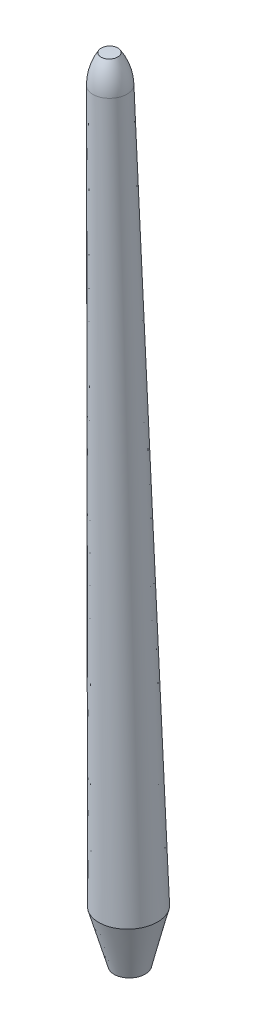
ISO-10303-21;
HEADER;
FILE_DESCRIPTION(('STEP AP214'),'2;1');
FILE_NAME('part.step','',(''),(''),'','','');
FILE_SCHEMA(('AUTOMOTIVE_DESIGN { 1 0 10303 214 1 1 1 1 }'));
ENDSEC;
DATA;
#1=APPLICATION_CONTEXT('core data for automotive mechanical design processes');
#2=APPLICATION_PROTOCOL_DEFINITION('international standard','automotive_design',2000,#1);
#3=PRODUCT_CONTEXT('',#1,'mechanical');
#4=PRODUCT('Part','Part','',(#3));
#5=PRODUCT_RELATED_PRODUCT_CATEGORY('part','',(#4));
#6=PRODUCT_DEFINITION_FORMATION('','',#4);
#7=PRODUCT_DEFINITION_CONTEXT('part definition',#1,'design');
#8=PRODUCT_DEFINITION('design','',#6,#7);
#9=PRODUCT_DEFINITION_SHAPE('','',#8);
#10=(LENGTH_UNIT() NAMED_UNIT(*) SI_UNIT(.MILLI.,.METRE.));
#11=(NAMED_UNIT(*) PLANE_ANGLE_UNIT() SI_UNIT($,.RADIAN.));
#12=(NAMED_UNIT(*) SI_UNIT($,.STERADIAN.) SOLID_ANGLE_UNIT());
#13=UNCERTAINTY_MEASURE_WITH_UNIT(LENGTH_MEASURE(1.E-05),#10,'distance_accuracy_value','');
#14=(GEOMETRIC_REPRESENTATION_CONTEXT(3) GLOBAL_UNCERTAINTY_ASSIGNED_CONTEXT((#13)) GLOBAL_UNIT_ASSIGNED_CONTEXT((#10,
#11,#12)) REPRESENTATION_CONTEXT('',''));
#15=CARTESIAN_POINT('',(0.,0.,0.));
#16=DIRECTION('',(0.,0.,1.));
#17=DIRECTION('',(1.,0.,0.));
#18=AXIS2_PLACEMENT_3D('',#15,#16,#17);
#19=CARTESIAN_POINT('',(0.,0.,0.));
#20=DIRECTION('',(0.0261417751526213,-0.999658245397831,0.));
#21=DIRECTION('',(0.999658245397831,0.0261417751526213,0.));
#22=AXIS2_PLACEMENT_3D('',#19,#20,#21);
#23=CONICAL_SURFACE('',#22,0.,1.54465157321113);
#24=CARTESIAN_POINT('',(0.130186253748804,-4.97830622586458,0.));
#25=DIRECTION('',(0.0261417751526213,-0.999658245397831,0.));
#26=DIRECTION('',(0.999658245397831,0.0261417751526213,0.));
#27=AXIS2_PLACEMENT_3D('',#24,#25,#26);
#28=CIRCLE('',#27,190.434895748287);
#29=CARTESIAN_POINT('',(-190.239627492502,-9.95661245172917,0.));
#30=VERTEX_POINT('',#29);
#31=EDGE_CURVE('E11',#30,#30,#28,.T.);
#32=ORIENTED_EDGE('',*,*,#31,.T.);
#33=EDGE_LOOP('',(#32));
#34=FACE_BOUND('',#33,.T.);
#35=CARTESIAN_POINT('',(0.,0.,0.));
#36=VERTEX_POINT('',#35);
#37=VERTEX_LOOP('',#36);
#38=FACE_BOUND('',#37,.T.);
#39=ADVANCED_FACE('F37',(#34,#38),#23,.F.);
#40=CARTESIAN_POINT('',(0.130186253748804,-4.97830622586458,0.));
#41=DIRECTION('',(-0.0261417751526213,0.999658245397831,0.));
#42=DIRECTION('',(-0.999658245397831,-0.0261417751526213,0.));
#43=AXIS2_PLACEMENT_3D('',#40,#41,#42);
#44=CONICAL_SURFACE('',#43,190.434895748287,0.26179938779915);
#45=CARTESIAN_POINT('',(-16.3599685026781,625.603170124086,0.));
#46=DIRECTION('',(0.0261417751526213,-0.999658245397831,0.));
#47=DIRECTION('',(0.999658245397831,0.0261417751526213,0.));
#48=AXIS2_PLACEMENT_3D('',#45,#46,#47);
#49=CIRCLE('',#48,359.456456994704);
#50=CARTESIAN_POINT('',(-375.693579598924,616.206340248173,0.));
#51=VERTEX_POINT('',#50);
#52=EDGE_CURVE('E44',#51,#51,#49,.T.);
#53=CARTESIAN_POINT('',(-375.693579598924,616.206340248173,0.));
#54=CARTESIAN_POINT('',(-373.761767597816,609.683809490882,0.));
#55=CARTESIAN_POINT('',(-371.829955596707,603.161278733592,0.));
#56=CARTESIAN_POINT('',(-367.96633159449,590.11621721901,0.));
#57=CARTESIAN_POINT('',(-366.034519593382,583.59368646172,0.));
#58=CARTESIAN_POINT('',(-362.170895591164,570.548624947138,0.));
#59=CARTESIAN_POINT('',(-360.239083590056,564.026094189848,0.));
#60=CARTESIAN_POINT('',(-356.375459587839,550.981032675266,0.));
#61=CARTESIAN_POINT('',(-354.44364758673,544.458501917976,0.));
#62=CARTESIAN_POINT('',(-350.580023584513,531.413440403395,0.));
#63=CARTESIAN_POINT('',(-348.648211583405,524.890909646104,0.));
#64=CARTESIAN_POINT('',(-344.784587581187,511.845848131523,0.));
#65=CARTESIAN_POINT('',(-342.852775580079,505.323317374232,0.));
#66=CARTESIAN_POINT('',(-338.989151577862,492.278255859651,0.));
#67=CARTESIAN_POINT('',(-337.057339576753,485.75572510236,0.));
#68=CARTESIAN_POINT('',(-333.193715574536,472.710663587779,0.));
#69=CARTESIAN_POINT('',(-331.261903573427,466.188132830488,0.));
#70=CARTESIAN_POINT('',(-327.39827957121,453.143071315907,0.));
#71=CARTESIAN_POINT('',(-325.466467570102,446.620540558616,0.));
#72=CARTESIAN_POINT('',(-321.602843567885,433.575479044035,0.));
#73=CARTESIAN_POINT('',(-319.671031566776,427.052948286744,0.));
#74=CARTESIAN_POINT('',(-315.807407564559,414.007886772163,0.));
#75=CARTESIAN_POINT('',(-313.87559556345,407.485356014872,0.));
#76=CARTESIAN_POINT('',(-310.011971561233,394.440294500291,0.));
#77=CARTESIAN_POINT('',(-308.080159560125,387.917763743,0.));
#78=CARTESIAN_POINT('',(-304.216535557908,374.872702228419,0.));
#79=CARTESIAN_POINT('',(-302.284723556799,368.350171471128,0.));
#80=CARTESIAN_POINT('',(-298.421099554582,355.305109956547,0.));
#81=CARTESIAN_POINT('',(-296.489287553473,348.782579199256,0.));
#82=CARTESIAN_POINT('',(-292.625663551256,335.737517684675,0.));
#83=CARTESIAN_POINT('',(-290.693851550148,329.214986927384,0.));
#84=CARTESIAN_POINT('',(-286.830227547931,316.169925412803,0.));
#85=CARTESIAN_POINT('',(-284.898415546822,309.647394655513,0.));
#86=CARTESIAN_POINT('',(-281.034791544605,296.602333140931,0.));
#87=CARTESIAN_POINT('',(-279.102979543496,290.079802383641,0.));
#88=CARTESIAN_POINT('',(-275.239355541279,277.034740869059,0.));
#89=CARTESIAN_POINT('',(-273.307543540171,270.512210111769,0.));
#90=CARTESIAN_POINT('',(-269.443919537953,257.467148597187,0.));
#91=CARTESIAN_POINT('',(-267.512107536845,250.944617839897,0.));
#92=CARTESIAN_POINT('',(-263.648483534628,237.899556325315,0.));
#93=CARTESIAN_POINT('',(-261.716671533519,231.377025568025,0.));
#94=CARTESIAN_POINT('',(-257.853047531302,218.331964053443,0.));
#95=CARTESIAN_POINT('',(-255.921235530194,211.809433296153,0.));
#96=CARTESIAN_POINT('',(-252.057611527976,198.764371781572,0.));
#97=CARTESIAN_POINT('',(-250.125799526868,192.241841024281,0.));
#98=CARTESIAN_POINT('',(-246.262175524651,179.1967795097,0.));
#99=CARTESIAN_POINT('',(-244.330363523542,172.674248752409,0.));
#100=CARTESIAN_POINT('',(-240.466739521325,159.629187237828,0.));
#101=CARTESIAN_POINT('',(-238.534927520216,153.106656480537,0.));
#102=CARTESIAN_POINT('',(-234.671303517999,140.061594965956,0.));
#103=CARTESIAN_POINT('',(-232.739491516891,133.539064208665,0.));
#104=CARTESIAN_POINT('',(-228.875867514674,120.494002694084,0.));
#105=CARTESIAN_POINT('',(-226.944055513565,113.971471936793,0.));
#106=CARTESIAN_POINT('',(-223.080431511348,100.926410422212,0.));
#107=CARTESIAN_POINT('',(-221.148619510239,94.4038796649212,0.));
#108=CARTESIAN_POINT('',(-217.284995508022,81.3588181503399,0.));
#109=CARTESIAN_POINT('',(-215.353183506914,74.8362873930493,0.));
#110=CARTESIAN_POINT('',(-211.489559504697,61.791225878468,0.));
#111=CARTESIAN_POINT('',(-209.557747503588,55.2686951211773,0.));
#112=CARTESIAN_POINT('',(-205.694123501371,42.223633606596,0.));
#113=CARTESIAN_POINT('',(-203.762311500262,35.7011028493054,0.));
#114=CARTESIAN_POINT('',(-199.898687498045,22.6560413347241,0.));
#115=CARTESIAN_POINT('',(-197.966875496937,16.1335105774334,0.));
#116=CARTESIAN_POINT('',(-194.10325149472,3.0884490628521,0.));
#117=CARTESIAN_POINT('',(-192.171439493611,-3.43408169443854,0.));
#118=CARTESIAN_POINT('',(-190.239627492502,-9.95661245172917,0.));
#119=B_SPLINE_CURVE_WITH_KNOTS('',3,(#53,#54,#55,#56,#57,#58,#59,#60,#61,#62,#63,#64,#65,#66,
#67,#68,#69,#70,#71,#72,#73,#74,#75,#76,#77,#78,#79,#80,#81,#82,#83,#84,#85,#86,#87,#88,#89,#90,
#91,#92,#93,#94,#95,#96,#97,#98,#99,#100,#101,#102,#103,#104,#105,#106,#107,#108,#109,#110,#111,
#112,#113,#114,#115,#116,#117,#118),.UNSPECIFIED.,.F.,.F.,(4,2,2,2,2,2,2,2,2,2,2,2,2,2,2,2,2,2,
2,2,2,2,2,2,2,2,2,2,2,2,2,2,4),(0.,20.4077864009517,40.8155728019034,61.2233592028549,
81.6311456038066,102.038932004758,122.44671840571,142.854504806661,163.262291207613,
183.670077608565,204.077864009516,224.485650410468,244.89343681142,265.301223212371,
285.709009613323,306.116796014274,326.524582415226,346.932368816178,367.340155217129,
387.747941618081,408.155728019032,428.563514419984,448.971300820936,469.379087221887,
489.786873622839,510.194660023791,530.602446424742,551.010232825694,571.418019226645,
591.825805627597,612.233592028549,632.6413784295,653.049164830452),.UNSPECIFIED.);
#120=EDGE_CURVE('BSEAM51',#51,#30,#119,.T.);
#121=ORIENTED_EDGE('',*,*,#52,.T.);
#122=ORIENTED_EDGE('',*,*,#31,.F.);
#123=ORIENTED_EDGE('',*,*,#120,.T.);
#124=ORIENTED_EDGE('',*,*,#120,.F.);
#125=EDGE_LOOP('',(#121,#123,#122,#124));
#126=FACE_BOUND('',#125,.T.);
#127=ADVANCED_FACE('F51',(#126),#44,.T.);
#128=CARTESIAN_POINT('',(-16.3599685026781,625.603170124086,0.));
#129=DIRECTION('',(0.0261417751526213,-0.999658245397831,0.));
#130=DIRECTION('',(0.999658245397831,0.0261417751526213,0.));
#131=AXIS2_PLACEMENT_3D('',#128,#129,#130);
#132=CONICAL_SURFACE('',#131,359.456456994704,0.0174532925199434);
#133=CARTESIAN_POINT('',(-243.364301592303,9306.22076358253,0.));
#134=DIRECTION('',(0.0261417751526213,-0.999658245397831,0.));
#135=DIRECTION('',(0.999658245397831,0.0261417751526213,0.));
#136=AXIS2_PLACEMENT_3D('',#133,#134,#135);
#137=CIRCLE('',#136,207.883912669272);
#138=CARTESIAN_POINT('',(-35.5514342069018,9311.65521808537,0.));
#139=VERTEX_POINT('',#138);
#140=EDGE_CURVE('E79',#139,#139,#137,.T.);
#141=ORIENTED_EDGE('',*,*,#140,.T.);
#142=EDGE_LOOP('',(#141));
#143=FACE_BOUND('',#142,.T.);
#144=ORIENTED_EDGE('',*,*,#52,.F.);
#145=EDGE_LOOP('',(#144));
#146=FACE_BOUND('',#145,.T.);
#147=ADVANCED_FACE('F56',(#143,#146),#132,.T.);
#148=CARTESIAN_POINT('',(-243.070675113618,9294.99252338955,0.));
#149=DIRECTION('',(0.0261417751526213,-0.999658245397831,0.));
#150=DIRECTION('',(0.999658245397831,0.0261417751526213,0.));
#151=AXIS2_PLACEMENT_3D('',#148,#149,#150);
#152=DEGENERATE_TOROIDAL_SURFACE('',#151,435.601451251877,643.583384787918,.F.);
#153=CARTESIAN_POINT('',(-252.337242247205,9649.3449033462,0.));
#154=DIRECTION('',(0.0261417751526213,-0.999658245397831,0.));
#155=DIRECTION('',(0.999658245397831,0.0261417751526213,0.));
#156=AXIS2_PLACEMENT_3D('',#153,#154,#155);
#157=CIRCLE('',#156,101.56527773242);
#158=CARTESIAN_POINT('',(-150.806674915871,9652.,0.));
#159=VERTEX_POINT('',#158);
#160=EDGE_CURVE('E78',#159,#159,#157,.T.);
#161=ORIENTED_EDGE('',*,*,#160,.T.);
#162=EDGE_LOOP('',(#161));
#163=FACE_BOUND('',#162,.T.);
#164=ORIENTED_EDGE('',*,*,#140,.F.);
#165=EDGE_LOOP('',(#164));
#166=FACE_BOUND('',#165,.T.);
#167=ADVANCED_FACE('F63',(#163,#166),#152,.F.);
#168=CARTESIAN_POINT('',(-252.337242247205,9649.3449033462,0.));
#169=DIRECTION('',(0.0261417751526213,-0.999658245397831,0.));
#170=DIRECTION('',(0.999658245397831,0.0261417751526213,0.));
#171=AXIS2_PLACEMENT_3D('',#168,#169,#170);
#172=CONICAL_SURFACE('',#171,101.56527773242,1.54465157321114);
#173=CARTESIAN_POINT('',(-252.406674915871,9652.,0.));
#174=VERTEX_POINT('',#173);
#175=VERTEX_LOOP('',#174);
#176=FACE_BOUND('',#175,.T.);
#177=ORIENTED_EDGE('',*,*,#160,.F.);
#178=EDGE_LOOP('',(#177));
#179=FACE_BOUND('',#178,.T.);
#180=ADVANCED_FACE('F70',(#176,#179),#172,.T.);
#181=CLOSED_SHELL('',(#39,#127,#147,#167,#180));
#182=MANIFOLD_SOLID_BREP('B2',#181);
#183=ADVANCED_BREP_SHAPE_REPRESENTATION('',(#18,#182),#14);
#184=SHAPE_DEFINITION_REPRESENTATION(#9,#183);
ENDSEC;
END-ISO-10303-21;
